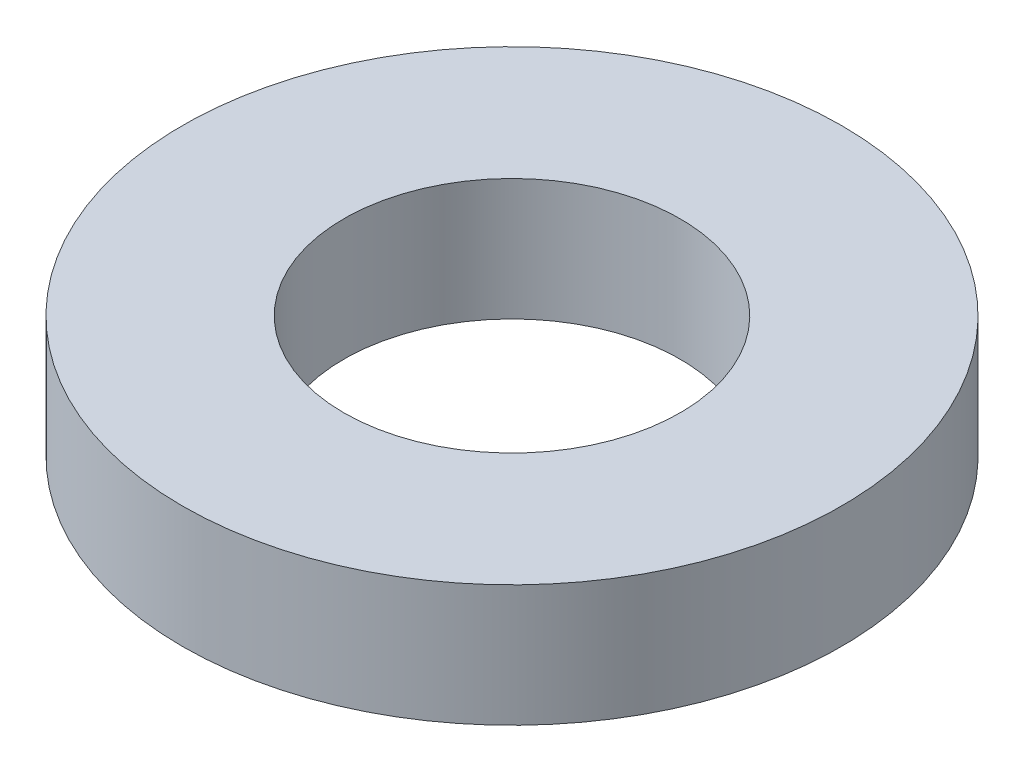
ISO-10303-21;
HEADER;
FILE_DESCRIPTION(('STEP AP214'),'2;1');
FILE_NAME('part.step','',(''),(''),'','','');
FILE_SCHEMA(('AUTOMOTIVE_DESIGN { 1 0 10303 214 1 1 1 1 }'));
ENDSEC;
DATA;
#1=APPLICATION_CONTEXT('core data for automotive mechanical design processes');
#2=APPLICATION_PROTOCOL_DEFINITION('international standard','automotive_design',2000,#1);
#3=PRODUCT_CONTEXT('',#1,'mechanical');
#4=PRODUCT('Part','Part','',(#3));
#5=PRODUCT_RELATED_PRODUCT_CATEGORY('part','',(#4));
#6=PRODUCT_DEFINITION_FORMATION('','',#4);
#7=PRODUCT_DEFINITION_CONTEXT('part definition',#1,'design');
#8=PRODUCT_DEFINITION('design','',#6,#7);
#9=PRODUCT_DEFINITION_SHAPE('','',#8);
#10=(LENGTH_UNIT() NAMED_UNIT(*) SI_UNIT(.MILLI.,.METRE.));
#11=(NAMED_UNIT(*) PLANE_ANGLE_UNIT() SI_UNIT($,.RADIAN.));
#12=(NAMED_UNIT(*) SI_UNIT($,.STERADIAN.) SOLID_ANGLE_UNIT());
#13=UNCERTAINTY_MEASURE_WITH_UNIT(LENGTH_MEASURE(1.E-05),#10,'distance_accuracy_value','');
#14=(GEOMETRIC_REPRESENTATION_CONTEXT(3) GLOBAL_UNCERTAINTY_ASSIGNED_CONTEXT((#13)) GLOBAL_UNIT_ASSIGNED_CONTEXT((#10,
#11,#12)) REPRESENTATION_CONTEXT('',''));
#15=CARTESIAN_POINT('',(0.,0.,0.));
#16=DIRECTION('',(0.,0.,1.));
#17=DIRECTION('',(1.,0.,0.));
#18=AXIS2_PLACEMENT_3D('',#15,#16,#17);
#19=CARTESIAN_POINT('',(0.,2.93,0.));
#20=DIRECTION('',(0.,-1.,0.));
#21=DIRECTION('',(0.,0.,-1.));
#22=AXIS2_PLACEMENT_3D('',#19,#20,#21);
#23=CYLINDRICAL_SURFACE('',#22,7.9375);
#24=CARTESIAN_POINT('',(0.,2.93,0.));
#25=DIRECTION('',(0.,1.,0.));
#26=DIRECTION('',(0.,0.,1.));
#27=AXIS2_PLACEMENT_3D('',#24,#25,#26);
#28=CIRCLE('',#27,7.9375);
#29=CARTESIAN_POINT('',(0.,2.93,-7.9375));
#30=VERTEX_POINT('',#29);
#31=EDGE_CURVE('E10',#30,#30,#28,.T.);
#32=CARTESIAN_POINT('',(0.,0.,0.));
#33=DIRECTION('',(0.,1.,0.));
#34=DIRECTION('',(0.,0.,1.));
#35=AXIS2_PLACEMENT_3D('',#32,#33,#34);
#36=CIRCLE('',#35,7.9375);
#37=CARTESIAN_POINT('',(0.,0.,-7.9375));
#38=VERTEX_POINT('',#37);
#39=EDGE_CURVE('E46',#38,#38,#36,.T.);
#40=CARTESIAN_POINT('',(0.,2.93,-7.9375));
#41=CARTESIAN_POINT('',(0.,2.89947916666667,-7.9375));
#42=CARTESIAN_POINT('',(0.,2.86895833333333,-7.9375));
#43=CARTESIAN_POINT('',(0.,2.80791666666667,-7.9375));
#44=CARTESIAN_POINT('',(0.,2.77739583333333,-7.9375));
#45=CARTESIAN_POINT('',(0.,2.71635416666667,-7.9375));
#46=CARTESIAN_POINT('',(0.,2.68583333333333,-7.9375));
#47=CARTESIAN_POINT('',(0.,2.62479166666667,-7.9375));
#48=CARTESIAN_POINT('',(0.,2.59427083333333,-7.9375));
#49=CARTESIAN_POINT('',(0.,2.53322916666667,-7.9375));
#50=CARTESIAN_POINT('',(0.,2.50270833333333,-7.9375));
#51=CARTESIAN_POINT('',(0.,2.44166666666667,-7.9375));
#52=CARTESIAN_POINT('',(0.,2.41114583333333,-7.9375));
#53=CARTESIAN_POINT('',(0.,2.35010416666667,-7.9375));
#54=CARTESIAN_POINT('',(0.,2.31958333333333,-7.9375));
#55=CARTESIAN_POINT('',(0.,2.25854166666667,-7.9375));
#56=CARTESIAN_POINT('',(0.,2.22802083333333,-7.9375));
#57=CARTESIAN_POINT('',(0.,2.16697916666667,-7.9375));
#58=CARTESIAN_POINT('',(0.,2.13645833333333,-7.9375));
#59=CARTESIAN_POINT('',(0.,2.07541666666667,-7.9375));
#60=CARTESIAN_POINT('',(0.,2.04489583333333,-7.9375));
#61=CARTESIAN_POINT('',(0.,1.98385416666667,-7.9375));
#62=CARTESIAN_POINT('',(0.,1.95333333333333,-7.9375));
#63=CARTESIAN_POINT('',(0.,1.89229166666667,-7.9375));
#64=CARTESIAN_POINT('',(0.,1.86177083333333,-7.9375));
#65=CARTESIAN_POINT('',(0.,1.80072916666667,-7.9375));
#66=CARTESIAN_POINT('',(0.,1.77020833333333,-7.9375));
#67=CARTESIAN_POINT('',(0.,1.70916666666667,-7.9375));
#68=CARTESIAN_POINT('',(0.,1.67864583333333,-7.9375));
#69=CARTESIAN_POINT('',(0.,1.61760416666667,-7.9375));
#70=CARTESIAN_POINT('',(0.,1.58708333333333,-7.9375));
#71=CARTESIAN_POINT('',(0.,1.52604166666667,-7.9375));
#72=CARTESIAN_POINT('',(0.,1.49552083333333,-7.9375));
#73=CARTESIAN_POINT('',(0.,1.43447916666667,-7.9375));
#74=CARTESIAN_POINT('',(0.,1.40395833333333,-7.9375));
#75=CARTESIAN_POINT('',(0.,1.34291666666667,-7.9375));
#76=CARTESIAN_POINT('',(0.,1.31239583333333,-7.9375));
#77=CARTESIAN_POINT('',(0.,1.25135416666667,-7.9375));
#78=CARTESIAN_POINT('',(0.,1.22083333333333,-7.9375));
#79=CARTESIAN_POINT('',(0.,1.15979166666667,-7.9375));
#80=CARTESIAN_POINT('',(0.,1.12927083333333,-7.9375));
#81=CARTESIAN_POINT('',(0.,1.06822916666667,-7.9375));
#82=CARTESIAN_POINT('',(0.,1.03770833333333,-7.9375));
#83=CARTESIAN_POINT('',(0.,0.976666666666666,-7.9375));
#84=CARTESIAN_POINT('',(0.,0.946145833333333,-7.9375));
#85=CARTESIAN_POINT('',(0.,0.885104166666666,-7.9375));
#86=CARTESIAN_POINT('',(0.,0.854583333333333,-7.9375));
#87=CARTESIAN_POINT('',(0.,0.793541666666666,-7.9375));
#88=CARTESIAN_POINT('',(0.,0.763020833333333,-7.9375));
#89=CARTESIAN_POINT('',(0.,0.701979166666666,-7.9375));
#90=CARTESIAN_POINT('',(0.,0.671458333333333,-7.9375));
#91=CARTESIAN_POINT('',(0.,0.610416666666666,-7.9375));
#92=CARTESIAN_POINT('',(0.,0.579895833333333,-7.9375));
#93=CARTESIAN_POINT('',(0.,0.518854166666666,-7.9375));
#94=CARTESIAN_POINT('',(0.,0.488333333333333,-7.9375));
#95=CARTESIAN_POINT('',(0.,0.427291666666667,-7.9375));
#96=CARTESIAN_POINT('',(0.,0.396770833333333,-7.9375));
#97=CARTESIAN_POINT('',(0.,0.335729166666666,-7.9375));
#98=CARTESIAN_POINT('',(0.,0.305208333333333,-7.9375));
#99=CARTESIAN_POINT('',(0.,0.244166666666666,-7.9375));
#100=CARTESIAN_POINT('',(0.,0.213645833333333,-7.9375));
#101=CARTESIAN_POINT('',(0.,0.152604166666666,-7.9375));
#102=CARTESIAN_POINT('',(0.,0.122083333333333,-7.9375));
#103=CARTESIAN_POINT('',(0.,0.0610416666666663,-7.9375));
#104=CARTESIAN_POINT('',(0.,0.0305208333333329,-7.9375));
#105=CARTESIAN_POINT('',(0.,0.,-7.9375));
#106=B_SPLINE_CURVE_WITH_KNOTS('',3,(#40,#41,#42,#43,#44,#45,#46,#47,#48,#49,#50,#51,#52,#53,
#54,#55,#56,#57,#58,#59,#60,#61,#62,#63,#64,#65,#66,#67,#68,#69,#70,#71,#72,#73,#74,#75,#76,#77,
#78,#79,#80,#81,#82,#83,#84,#85,#86,#87,#88,#89,#90,#91,#92,#93,#94,#95,#96,#97,#98,#99,#100,
#101,#102,#103,#104,#105),.UNSPECIFIED.,.F.,.F.,(4,2,2,2,2,2,2,2,2,2,2,2,2,2,2,2,2,2,2,2,2,2,2,
2,2,2,2,2,2,2,2,2,4),(0.,0.0915624999999996,0.183125,0.2746875,0.36625,0.4578125,0.549375,
0.6409375,0.7325,0.8240625,0.915625,1.0071875,1.09875,1.1903125,1.281875,1.3734375,1.465,
1.5565625,1.648125,1.7396875,1.83125,1.9228125,2.014375,2.1059375,2.1975,2.2890625,2.380625,
2.4721875,2.56375,2.6553125,2.746875,2.8384375,2.93),.UNSPECIFIED.);
#107=EDGE_CURVE('BSEAM43',#30,#38,#106,.T.);
#108=ORIENTED_EDGE('',*,*,#31,.F.);
#109=ORIENTED_EDGE('',*,*,#39,.T.);
#110=ORIENTED_EDGE('',*,*,#107,.T.);
#111=ORIENTED_EDGE('',*,*,#107,.F.);
#112=EDGE_LOOP('',(#108,#110,#109,#111));
#113=FACE_BOUND('',#112,.T.);
#114=ADVANCED_FACE('F43',(#113),#23,.T.);
#115=CARTESIAN_POINT('',(0.,2.93,0.));
#116=DIRECTION('',(0.,1.,0.));
#117=DIRECTION('',(0.,0.,1.));
#118=AXIS2_PLACEMENT_3D('',#115,#116,#117);
#119=PLANE('',#118);
#120=CARTESIAN_POINT('',(0.,2.93,0.));
#121=DIRECTION('',(0.,1.,0.));
#122=DIRECTION('',(0.,0.,1.));
#123=AXIS2_PLACEMENT_3D('',#120,#121,#122);
#124=CIRCLE('',#123,4.05);
#125=CARTESIAN_POINT('',(0.,2.93,4.05));
#126=VERTEX_POINT('',#125);
#127=EDGE_CURVE('E57',#126,#126,#124,.T.);
#128=ORIENTED_EDGE('',*,*,#127,.F.);
#129=EDGE_LOOP('',(#128));
#130=FACE_BOUND('',#129,.T.);
#131=ORIENTED_EDGE('',*,*,#31,.T.);
#132=EDGE_LOOP('',(#131));
#133=FACE_BOUND('',#132,.T.);
#134=ADVANCED_FACE('F74',(#130,#133),#119,.T.);
#135=CARTESIAN_POINT('',(0.,0.,0.));
#136=DIRECTION('',(0.,1.,0.));
#137=DIRECTION('',(0.,0.,1.));
#138=AXIS2_PLACEMENT_3D('',#135,#136,#137);
#139=PLANE('',#138);
#140=CARTESIAN_POINT('',(0.,0.,0.));
#141=DIRECTION('',(0.,1.,0.));
#142=DIRECTION('',(0.,0.,1.));
#143=AXIS2_PLACEMENT_3D('',#140,#141,#142);
#144=CIRCLE('',#143,4.05);
#145=CARTESIAN_POINT('',(0.,0.,4.05));
#146=VERTEX_POINT('',#145);
#147=EDGE_CURVE('E55',#146,#146,#144,.T.);
#148=ORIENTED_EDGE('',*,*,#147,.T.);
#149=EDGE_LOOP('',(#148));
#150=FACE_BOUND('',#149,.T.);
#151=ORIENTED_EDGE('',*,*,#39,.F.);
#152=EDGE_LOOP('',(#151));
#153=FACE_BOUND('',#152,.T.);
#154=ADVANCED_FACE('F65',(#150,#153),#139,.F.);
#155=CARTESIAN_POINT('',(0.,0.,0.));
#156=DIRECTION('',(0.,1.,0.));
#157=DIRECTION('',(0.,0.,1.));
#158=AXIS2_PLACEMENT_3D('',#155,#156,#157);
#159=CYLINDRICAL_SURFACE('',#158,4.05);
#160=CARTESIAN_POINT('',(0.,0.,4.05));
#161=CARTESIAN_POINT('',(0.,0.0305208333333333,4.05));
#162=CARTESIAN_POINT('',(0.,0.0610416666666667,4.05));
#163=CARTESIAN_POINT('',(0.,0.122083333333333,4.05));
#164=CARTESIAN_POINT('',(0.,0.152604166666667,4.05));
#165=CARTESIAN_POINT('',(0.,0.213645833333333,4.05));
#166=CARTESIAN_POINT('',(0.,0.244166666666667,4.05));
#167=CARTESIAN_POINT('',(0.,0.305208333333333,4.05));
#168=CARTESIAN_POINT('',(0.,0.335729166666667,4.05));
#169=CARTESIAN_POINT('',(0.,0.396770833333333,4.05));
#170=CARTESIAN_POINT('',(0.,0.427291666666667,4.05));
#171=CARTESIAN_POINT('',(0.,0.488333333333333,4.05));
#172=CARTESIAN_POINT('',(0.,0.518854166666667,4.05));
#173=CARTESIAN_POINT('',(0.,0.579895833333333,4.05));
#174=CARTESIAN_POINT('',(0.,0.610416666666666,4.05));
#175=CARTESIAN_POINT('',(0.,0.671458333333333,4.05));
#176=CARTESIAN_POINT('',(0.,0.701979166666667,4.05));
#177=CARTESIAN_POINT('',(0.,0.763020833333333,4.05));
#178=CARTESIAN_POINT('',(0.,0.793541666666667,4.05));
#179=CARTESIAN_POINT('',(0.,0.854583333333333,4.05));
#180=CARTESIAN_POINT('',(0.,0.885104166666667,4.05));
#181=CARTESIAN_POINT('',(0.,0.946145833333333,4.05));
#182=CARTESIAN_POINT('',(0.,0.976666666666666,4.05));
#183=CARTESIAN_POINT('',(0.,1.03770833333333,4.05));
#184=CARTESIAN_POINT('',(0.,1.06822916666667,4.05));
#185=CARTESIAN_POINT('',(0.,1.12927083333333,4.05));
#186=CARTESIAN_POINT('',(0.,1.15979166666667,4.05));
#187=CARTESIAN_POINT('',(0.,1.22083333333333,4.05));
#188=CARTESIAN_POINT('',(0.,1.25135416666667,4.05));
#189=CARTESIAN_POINT('',(0.,1.31239583333333,4.05));
#190=CARTESIAN_POINT('',(0.,1.34291666666667,4.05));
#191=CARTESIAN_POINT('',(0.,1.40395833333333,4.05));
#192=CARTESIAN_POINT('',(0.,1.43447916666667,4.05));
#193=CARTESIAN_POINT('',(0.,1.49552083333333,4.05));
#194=CARTESIAN_POINT('',(0.,1.52604166666667,4.05));
#195=CARTESIAN_POINT('',(0.,1.58708333333333,4.05));
#196=CARTESIAN_POINT('',(0.,1.61760416666667,4.05));
#197=CARTESIAN_POINT('',(0.,1.67864583333333,4.05));
#198=CARTESIAN_POINT('',(0.,1.70916666666667,4.05));
#199=CARTESIAN_POINT('',(0.,1.77020833333333,4.05));
#200=CARTESIAN_POINT('',(0.,1.80072916666667,4.05));
#201=CARTESIAN_POINT('',(0.,1.86177083333333,4.05));
#202=CARTESIAN_POINT('',(0.,1.89229166666667,4.05));
#203=CARTESIAN_POINT('',(0.,1.95333333333333,4.05));
#204=CARTESIAN_POINT('',(0.,1.98385416666667,4.05));
#205=CARTESIAN_POINT('',(0.,2.04489583333333,4.05));
#206=CARTESIAN_POINT('',(0.,2.07541666666667,4.05));
#207=CARTESIAN_POINT('',(0.,2.13645833333333,4.05));
#208=CARTESIAN_POINT('',(0.,2.16697916666667,4.05));
#209=CARTESIAN_POINT('',(0.,2.22802083333333,4.05));
#210=CARTESIAN_POINT('',(0.,2.25854166666667,4.05));
#211=CARTESIAN_POINT('',(0.,2.31958333333333,4.05));
#212=CARTESIAN_POINT('',(0.,2.35010416666667,4.05));
#213=CARTESIAN_POINT('',(0.,2.41114583333333,4.05));
#214=CARTESIAN_POINT('',(0.,2.44166666666667,4.05));
#215=CARTESIAN_POINT('',(0.,2.50270833333333,4.05));
#216=CARTESIAN_POINT('',(0.,2.53322916666667,4.05));
#217=CARTESIAN_POINT('',(0.,2.59427083333333,4.05));
#218=CARTESIAN_POINT('',(0.,2.62479166666667,4.05));
#219=CARTESIAN_POINT('',(0.,2.68583333333333,4.05));
#220=CARTESIAN_POINT('',(0.,2.71635416666667,4.05));
#221=CARTESIAN_POINT('',(0.,2.77739583333333,4.05));
#222=CARTESIAN_POINT('',(0.,2.80791666666667,4.05));
#223=CARTESIAN_POINT('',(0.,2.86895833333333,4.05));
#224=CARTESIAN_POINT('',(0.,2.89947916666667,4.05));
#225=CARTESIAN_POINT('',(0.,2.93,4.05));
#226=B_SPLINE_CURVE_WITH_KNOTS('',3,(#160,#161,#162,#163,#164,#165,#166,#167,#168,#169,#170,
#171,#172,#173,#174,#175,#176,#177,#178,#179,#180,#181,#182,#183,#184,#185,#186,#187,#188,#189,
#190,#191,#192,#193,#194,#195,#196,#197,#198,#199,#200,#201,#202,#203,#204,#205,#206,#207,#208,
#209,#210,#211,#212,#213,#214,#215,#216,#217,#218,#219,#220,#221,#222,#223,#224,#225),
.UNSPECIFIED.,.F.,.F.,(4,2,2,2,2,2,2,2,2,2,2,2,2,2,2,2,2,2,2,2,2,2,2,2,2,2,2,2,2,2,2,2,4),(0.,
0.0915625,0.183125,0.2746875,0.36625,0.4578125,0.549375,0.6409375,0.7325,0.8240625,0.915625,
1.0071875,1.09875,1.1903125,1.281875,1.3734375,1.465,1.5565625,1.648125,1.7396875,1.83125,
1.9228125,2.014375,2.1059375,2.1975,2.2890625,2.380625,2.4721875,2.56375,2.6553125,2.746875,
2.8384375,2.93),.UNSPECIFIED.);
#227=EDGE_CURVE('BSEAM68',#146,#126,#226,.T.);
#228=ORIENTED_EDGE('',*,*,#147,.F.);
#229=ORIENTED_EDGE('',*,*,#127,.T.);
#230=ORIENTED_EDGE('',*,*,#227,.T.);
#231=ORIENTED_EDGE('',*,*,#227,.F.);
#232=EDGE_LOOP('',(#228,#230,#229,#231));
#233=FACE_BOUND('',#232,.T.);
#234=ADVANCED_FACE('F68',(#233),#159,.F.);
#235=CLOSED_SHELL('',(#114,#134,#154,#234));
#236=MANIFOLD_SOLID_BREP('B2',#235);
#237=ADVANCED_BREP_SHAPE_REPRESENTATION('',(#18,#236),#14);
#238=SHAPE_DEFINITION_REPRESENTATION(#9,#237);
ENDSEC;
END-ISO-10303-21;
